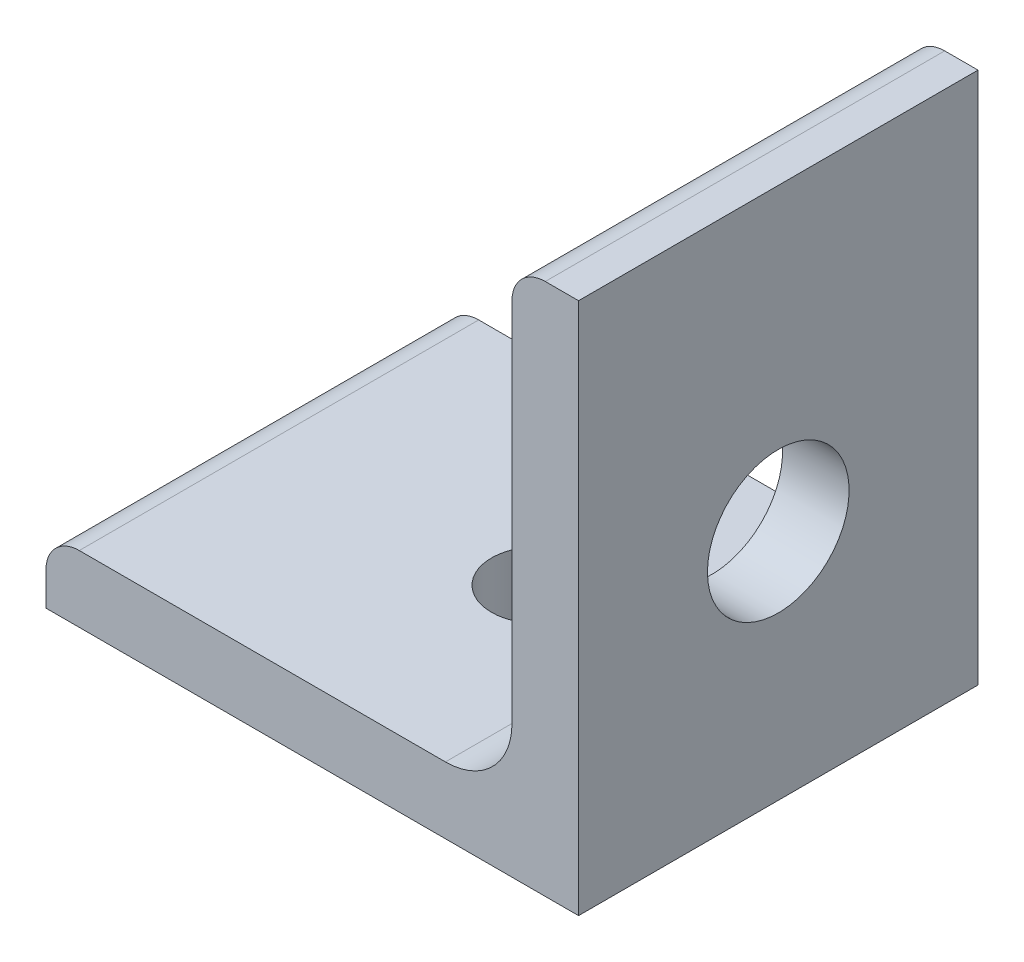
ISO-10303-21;
HEADER;
FILE_DESCRIPTION(('STEP AP214'),'2;1');
FILE_NAME('part.step','',(''),(''),'','','');
FILE_SCHEMA(('AUTOMOTIVE_DESIGN { 1 0 10303 214 1 1 1 1 }'));
ENDSEC;
DATA;
#1=APPLICATION_CONTEXT('core data for automotive mechanical design processes');
#2=APPLICATION_PROTOCOL_DEFINITION('international standard','automotive_design',2000,#1);
#3=PRODUCT_CONTEXT('',#1,'mechanical');
#4=PRODUCT('Part','Part','',(#3));
#5=PRODUCT_RELATED_PRODUCT_CATEGORY('part','',(#4));
#6=PRODUCT_DEFINITION_FORMATION('','',#4);
#7=PRODUCT_DEFINITION_CONTEXT('part definition',#1,'design');
#8=PRODUCT_DEFINITION('design','',#6,#7);
#9=PRODUCT_DEFINITION_SHAPE('','',#8);
#10=(LENGTH_UNIT() NAMED_UNIT(*) SI_UNIT(.MILLI.,.METRE.));
#11=(NAMED_UNIT(*) PLANE_ANGLE_UNIT() SI_UNIT($,.RADIAN.));
#12=(NAMED_UNIT(*) SI_UNIT($,.STERADIAN.) SOLID_ANGLE_UNIT());
#13=UNCERTAINTY_MEASURE_WITH_UNIT(LENGTH_MEASURE(1.E-05),#10,'distance_accuracy_value','');
#14=(GEOMETRIC_REPRESENTATION_CONTEXT(3) GLOBAL_UNCERTAINTY_ASSIGNED_CONTEXT((#13)) GLOBAL_UNIT_ASSIGNED_CONTEXT((#10,
#11,#12)) REPRESENTATION_CONTEXT('',''));
#15=CARTESIAN_POINT('',(0.,0.,0.));
#16=DIRECTION('',(0.,0.,1.));
#17=DIRECTION('',(1.,0.,0.));
#18=AXIS2_PLACEMENT_3D('',#15,#16,#17);
#19=CARTESIAN_POINT('',(-12.7,1.5875,9.525));
#20=DIRECTION('',(1.,0.,0.));
#21=DIRECTION('',(0.,0.,-1.));
#22=AXIS2_PLACEMENT_3D('',#19,#20,#21);
#23=PLANE('',#22);
#24=DIRECTION('',(0.,-1.,0.));
#25=VECTOR('',#24,1.);
#26=CARTESIAN_POINT('',(-12.7,1.5875,-9.525));
#27=LINE('',#26,#25);
#28=CARTESIAN_POINT('',(-12.7,1.5875,-9.525));
#29=VERTEX_POINT('',#28);
#30=CARTESIAN_POINT('',(-12.7,0.,-9.525));
#31=VERTEX_POINT('',#30);
#32=EDGE_CURVE('E147',#29,#31,#27,.T.);
#33=ORIENTED_EDGE('',*,*,#32,.T.);
#34=DIRECTION('',(0.,0.,-1.));
#35=VECTOR('',#34,1.);
#36=CARTESIAN_POINT('',(-12.7,0.,9.525));
#37=LINE('',#36,#35);
#38=CARTESIAN_POINT('',(-12.7,0.,9.525));
#39=VERTEX_POINT('',#38);
#40=EDGE_CURVE('E11',#39,#31,#37,.T.);
#41=ORIENTED_EDGE('',*,*,#40,.F.);
#42=DIRECTION('',(0.,-1.,0.));
#43=VECTOR('',#42,1.);
#44=CARTESIAN_POINT('',(-12.7,1.5875,9.525));
#45=LINE('',#44,#43);
#46=CARTESIAN_POINT('',(-12.7,1.5875,9.525));
#47=VERTEX_POINT('',#46);
#48=EDGE_CURVE('E173',#47,#39,#45,.T.);
#49=ORIENTED_EDGE('',*,*,#48,.F.);
#50=DIRECTION('',(0.,0.,-1.));
#51=VECTOR('',#50,1.);
#52=CARTESIAN_POINT('',(-12.7,1.5875,9.525));
#53=LINE('',#52,#51);
#54=EDGE_CURVE('E143',#47,#29,#53,.T.);
#55=ORIENTED_EDGE('',*,*,#54,.T.);
#56=EDGE_LOOP('',(#33,#41,#49,#55));
#57=FACE_BOUND('',#56,.T.);
#58=ADVANCED_FACE('F40',(#57),#23,.F.);
#59=CARTESIAN_POINT('',(-12.7,0.,9.525));
#60=DIRECTION('',(0.,1.,0.));
#61=DIRECTION('',(0.,0.,1.));
#62=AXIS2_PLACEMENT_3D('',#59,#60,#61);
#63=PLANE('',#62);
#64=CARTESIAN_POINT('',(1.27000000000001,0.,0.));
#65=DIRECTION('',(0.,1.,0.));
#66=DIRECTION('',(0.,0.,1.));
#67=AXIS2_PLACEMENT_3D('',#64,#65,#66);
#68=CIRCLE('',#67,2.2479);
#69=CARTESIAN_POINT('',(1.27000000000001,0.,2.2479));
#70=VERTEX_POINT('',#69);
#71=EDGE_CURVE('E234',#70,#70,#68,.T.);
#72=ORIENTED_EDGE('',*,*,#71,.T.);
#73=EDGE_LOOP('',(#72));
#74=FACE_BOUND('',#73,.T.);
#75=DIRECTION('',(1.,0.,0.));
#76=VECTOR('',#75,1.);
#77=CARTESIAN_POINT('',(-12.7,0.,-9.525));
#78=LINE('',#77,#76);
#79=CARTESIAN_POINT('',(12.7,0.,-9.525));
#80=VERTEX_POINT('',#79);
#81=EDGE_CURVE('E151',#31,#80,#78,.T.);
#82=ORIENTED_EDGE('',*,*,#81,.T.);
#83=DIRECTION('',(0.,0.,-1.));
#84=VECTOR('',#83,1.);
#85=CARTESIAN_POINT('',(12.7,0.,9.525));
#86=LINE('',#85,#84);
#87=CARTESIAN_POINT('',(12.7,0.,9.525));
#88=VERTEX_POINT('',#87);
#89=EDGE_CURVE('E49',#88,#80,#86,.T.);
#90=ORIENTED_EDGE('',*,*,#89,.F.);
#91=DIRECTION('',(1.,0.,0.));
#92=VECTOR('',#91,1.);
#93=CARTESIAN_POINT('',(-12.7,0.,9.525));
#94=LINE('',#93,#92);
#95=EDGE_CURVE('E103',#39,#88,#94,.T.);
#96=ORIENTED_EDGE('',*,*,#95,.F.);
#97=ORIENTED_EDGE('',*,*,#40,.T.);
#98=EDGE_LOOP('',(#82,#90,#96,#97));
#99=FACE_BOUND('',#98,.T.);
#100=ADVANCED_FACE('F258',(#74,#99),#63,.F.);
#101=CARTESIAN_POINT('',(12.7,0.,9.525));
#102=DIRECTION('',(-1.,0.,0.));
#103=DIRECTION('',(0.,0.,1.));
#104=AXIS2_PLACEMENT_3D('',#101,#102,#103);
#105=PLANE('',#104);
#106=CARTESIAN_POINT('',(12.7,11.1166148,0.));
#107=DIRECTION('',(-1.,0.,0.));
#108=DIRECTION('',(0.,0.,1.));
#109=AXIS2_PLACEMENT_3D('',#106,#107,#108);
#110=CIRCLE('',#109,3.3782);
#111=CARTESIAN_POINT('',(12.7,11.1166148,3.3782));
#112=VERTEX_POINT('',#111);
#113=EDGE_CURVE('E152',#112,#112,#110,.T.);
#114=ORIENTED_EDGE('',*,*,#113,.T.);
#115=EDGE_LOOP('',(#114));
#116=FACE_BOUND('',#115,.T.);
#117=DIRECTION('',(0.,1.,0.));
#118=VECTOR('',#117,1.);
#119=CARTESIAN_POINT('',(12.7,0.,-9.525));
#120=LINE('',#119,#118);
#121=CARTESIAN_POINT('',(12.7,25.4,-9.525));
#122=VERTEX_POINT('',#121);
#123=EDGE_CURVE('E155',#80,#122,#120,.T.);
#124=ORIENTED_EDGE('',*,*,#123,.T.);
#125=DIRECTION('',(0.,0.,-1.));
#126=VECTOR('',#125,1.);
#127=CARTESIAN_POINT('',(12.7,25.4,9.525));
#128=LINE('',#127,#126);
#129=CARTESIAN_POINT('',(12.7,25.4,9.525));
#130=VERTEX_POINT('',#129);
#131=EDGE_CURVE('E188',#130,#122,#128,.T.);
#132=ORIENTED_EDGE('',*,*,#131,.F.);
#133=DIRECTION('',(0.,1.,0.));
#134=VECTOR('',#133,1.);
#135=CARTESIAN_POINT('',(12.7,0.,9.525));
#136=LINE('',#135,#134);
#137=EDGE_CURVE('E198',#88,#130,#136,.T.);
#138=ORIENTED_EDGE('',*,*,#137,.F.);
#139=ORIENTED_EDGE('',*,*,#89,.T.);
#140=EDGE_LOOP('',(#124,#132,#138,#139));
#141=FACE_BOUND('',#140,.T.);
#142=ADVANCED_FACE('F196',(#116,#141),#105,.F.);
#143=CARTESIAN_POINT('',(11.1125,25.4,9.525));
#144=DIRECTION('',(0.,-1.,0.));
#145=DIRECTION('',(0.,0.,-1.));
#146=AXIS2_PLACEMENT_3D('',#143,#144,#145);
#147=PLANE('',#146);
#148=DIRECTION('',(-1.,0.,0.));
#149=VECTOR('',#148,1.);
#150=CARTESIAN_POINT('',(11.1125,25.4,-9.525));
#151=LINE('',#150,#149);
#152=CARTESIAN_POINT('',(11.1125,25.4,-9.525));
#153=VERTEX_POINT('',#152);
#154=EDGE_CURVE('E158',#122,#153,#151,.T.);
#155=ORIENTED_EDGE('',*,*,#154,.T.);
#156=DIRECTION('',(0.,0.,-1.));
#157=VECTOR('',#156,1.);
#158=CARTESIAN_POINT('',(11.1125,25.4,9.525));
#159=LINE('',#158,#157);
#160=CARTESIAN_POINT('',(11.1125,25.4,9.525));
#161=VERTEX_POINT('',#160);
#162=EDGE_CURVE('E184',#161,#153,#159,.T.);
#163=ORIENTED_EDGE('',*,*,#162,.F.);
#164=DIRECTION('',(-1.,0.,0.));
#165=VECTOR('',#164,1.);
#166=CARTESIAN_POINT('',(11.1125,25.4,9.525));
#167=LINE('',#166,#165);
#168=EDGE_CURVE('E215',#130,#161,#167,.T.);
#169=ORIENTED_EDGE('',*,*,#168,.F.);
#170=ORIENTED_EDGE('',*,*,#131,.T.);
#171=EDGE_LOOP('',(#155,#163,#169,#170));
#172=FACE_BOUND('',#171,.T.);
#173=ADVANCED_FACE('F207',(#172),#147,.F.);
#174=CARTESIAN_POINT('',(11.1125,23.8125,9.525));
#175=DIRECTION('',(0.,0.,-1.));
#176=DIRECTION('',(-1.,0.,0.));
#177=AXIS2_PLACEMENT_3D('',#174,#175,#176);
#178=CYLINDRICAL_SURFACE('',#177,1.5875);
#179=CARTESIAN_POINT('',(11.1125,23.8125,-9.525));
#180=DIRECTION('',(0.,0.,1.));
#181=DIRECTION('',(-1.,0.,0.));
#182=AXIS2_PLACEMENT_3D('',#179,#180,#181);
#183=CIRCLE('',#182,1.5875);
#184=CARTESIAN_POINT('',(9.525,23.8125,-9.525));
#185=VERTEX_POINT('',#184);
#186=EDGE_CURVE('E161',#153,#185,#183,.T.);
#187=ORIENTED_EDGE('',*,*,#186,.T.);
#188=DIRECTION('',(0.,0.,-1.));
#189=VECTOR('',#188,1.);
#190=CARTESIAN_POINT('',(9.525,23.8125,9.525));
#191=LINE('',#190,#189);
#192=CARTESIAN_POINT('',(9.525,23.8125,9.525));
#193=VERTEX_POINT('',#192);
#194=EDGE_CURVE('E180',#193,#185,#191,.T.);
#195=ORIENTED_EDGE('',*,*,#194,.F.);
#196=CARTESIAN_POINT('',(11.1125,23.8125,9.525));
#197=DIRECTION('',(0.,0.,1.));
#198=DIRECTION('',(-1.,0.,0.));
#199=AXIS2_PLACEMENT_3D('',#196,#197,#198);
#200=CIRCLE('',#199,1.5875);
#201=EDGE_CURVE('E213',#161,#193,#200,.T.);
#202=ORIENTED_EDGE('',*,*,#201,.F.);
#203=ORIENTED_EDGE('',*,*,#162,.T.);
#204=EDGE_LOOP('',(#187,#195,#202,#203));
#205=FACE_BOUND('',#204,.T.);
#206=ADVANCED_FACE('F211',(#205),#178,.T.);
#207=CARTESIAN_POINT('',(9.525,23.8125,9.525));
#208=DIRECTION('',(1.,0.,0.));
#209=DIRECTION('',(0.,0.,-1.));
#210=AXIS2_PLACEMENT_3D('',#207,#208,#209);
#211=PLANE('',#210);
#212=CARTESIAN_POINT('',(9.525,11.1166148,0.));
#213=DIRECTION('',(-1.,0.,0.));
#214=DIRECTION('',(0.,0.,1.));
#215=AXIS2_PLACEMENT_3D('',#212,#213,#214);
#216=CIRCLE('',#215,3.3782);
#217=CARTESIAN_POINT('',(9.525,11.1166148,3.3782));
#218=VERTEX_POINT('',#217);
#219=EDGE_CURVE('E230',#218,#218,#216,.T.);
#220=ORIENTED_EDGE('',*,*,#219,.F.);
#221=EDGE_LOOP('',(#220));
#222=FACE_BOUND('',#221,.T.);
#223=DIRECTION('',(0.,-1.,0.));
#224=VECTOR('',#223,1.);
#225=CARTESIAN_POINT('',(9.525,23.8125,-9.525));
#226=LINE('',#225,#224);
#227=CARTESIAN_POINT('',(9.525,6.35,-9.525));
#228=VERTEX_POINT('',#227);
#229=EDGE_CURVE('E164',#185,#228,#226,.T.);
#230=ORIENTED_EDGE('',*,*,#229,.T.);
#231=DIRECTION('',(0.,0.,-1.));
#232=VECTOR('',#231,1.);
#233=CARTESIAN_POINT('',(9.525,6.35,9.525));
#234=LINE('',#233,#232);
#235=CARTESIAN_POINT('',(9.525,6.35,9.525));
#236=VERTEX_POINT('',#235);
#237=EDGE_CURVE('E136',#236,#228,#234,.T.);
#238=ORIENTED_EDGE('',*,*,#237,.F.);
#239=DIRECTION('',(0.,-1.,0.));
#240=VECTOR('',#239,1.);
#241=CARTESIAN_POINT('',(9.525,23.8125,9.525));
#242=LINE('',#241,#240);
#243=EDGE_CURVE('E125',#193,#236,#242,.T.);
#244=ORIENTED_EDGE('',*,*,#243,.F.);
#245=ORIENTED_EDGE('',*,*,#194,.T.);
#246=EDGE_LOOP('',(#230,#238,#244,#245));
#247=FACE_BOUND('',#246,.T.);
#248=ADVANCED_FACE('F255',(#222,#247),#211,.F.);
#249=CARTESIAN_POINT('',(6.35000000000001,6.35,9.525));
#250=DIRECTION('',(0.,0.,-1.));
#251=DIRECTION('',(-1.,0.,0.));
#252=AXIS2_PLACEMENT_3D('',#249,#250,#251);
#253=CYLINDRICAL_SURFACE('',#252,3.175);
#254=CARTESIAN_POINT('',(6.35000000000001,6.35,-9.525));
#255=DIRECTION('',(0.,0.,-1.));
#256=DIRECTION('',(-1.,0.,0.));
#257=AXIS2_PLACEMENT_3D('',#254,#255,#256);
#258=CIRCLE('',#257,3.175);
#259=CARTESIAN_POINT('',(6.35000000000001,3.175,-9.525));
#260=VERTEX_POINT('',#259);
#261=EDGE_CURVE('E134',#228,#260,#258,.T.);
#262=ORIENTED_EDGE('',*,*,#261,.T.);
#263=DIRECTION('',(0.,0.,-1.));
#264=VECTOR('',#263,1.);
#265=CARTESIAN_POINT('',(6.35000000000001,3.175,9.525));
#266=LINE('',#265,#264);
#267=CARTESIAN_POINT('',(6.35000000000001,3.175,9.525));
#268=VERTEX_POINT('',#267);
#269=EDGE_CURVE('E131',#268,#260,#266,.T.);
#270=ORIENTED_EDGE('',*,*,#269,.F.);
#271=CARTESIAN_POINT('',(6.35000000000001,6.35,9.525));
#272=DIRECTION('',(0.,0.,-1.));
#273=DIRECTION('',(-1.,0.,0.));
#274=AXIS2_PLACEMENT_3D('',#271,#272,#273);
#275=CIRCLE('',#274,3.175);
#276=EDGE_CURVE('E119',#236,#268,#275,.T.);
#277=ORIENTED_EDGE('',*,*,#276,.F.);
#278=ORIENTED_EDGE('',*,*,#237,.T.);
#279=EDGE_LOOP('',(#262,#270,#277,#278));
#280=FACE_BOUND('',#279,.T.);
#281=ADVANCED_FACE('F132',(#280),#253,.F.);
#282=CARTESIAN_POINT('',(6.35000000000001,3.175,9.525));
#283=DIRECTION('',(0.,-1.,0.));
#284=DIRECTION('',(1.,0.,0.));
#285=AXIS2_PLACEMENT_3D('',#282,#283,#284);
#286=PLANE('',#285);
#287=CARTESIAN_POINT('',(1.27000000000001,3.175,0.));
#288=DIRECTION('',(0.,1.,0.));
#289=DIRECTION('',(0.,0.,1.));
#290=AXIS2_PLACEMENT_3D('',#287,#288,#289);
#291=CIRCLE('',#290,2.2479);
#292=CARTESIAN_POINT('',(1.27000000000001,3.175,2.2479));
#293=VERTEX_POINT('',#292);
#294=EDGE_CURVE('E238',#293,#293,#291,.T.);
#295=ORIENTED_EDGE('',*,*,#294,.F.);
#296=EDGE_LOOP('',(#295));
#297=FACE_BOUND('',#296,.T.);
#298=DIRECTION('',(-1.,0.,0.));
#299=VECTOR('',#298,1.);
#300=CARTESIAN_POINT('',(6.35000000000001,3.175,-9.525));
#301=LINE('',#300,#299);
#302=CARTESIAN_POINT('',(-11.1125,3.175,-9.525));
#303=VERTEX_POINT('',#302);
#304=EDGE_CURVE('E89',#260,#303,#301,.T.);
#305=ORIENTED_EDGE('',*,*,#304,.T.);
#306=DIRECTION('',(0.,0.,-1.));
#307=VECTOR('',#306,1.);
#308=CARTESIAN_POINT('',(-11.1125,3.175,9.525));
#309=LINE('',#308,#307);
#310=CARTESIAN_POINT('',(-11.1125,3.175,9.525));
#311=VERTEX_POINT('',#310);
#312=EDGE_CURVE('E137',#311,#303,#309,.T.);
#313=ORIENTED_EDGE('',*,*,#312,.F.);
#314=DIRECTION('',(-1.,0.,0.));
#315=VECTOR('',#314,1.);
#316=CARTESIAN_POINT('',(6.35000000000001,3.175,9.525));
#317=LINE('',#316,#315);
#318=EDGE_CURVE('E123',#268,#311,#317,.T.);
#319=ORIENTED_EDGE('',*,*,#318,.F.);
#320=ORIENTED_EDGE('',*,*,#269,.T.);
#321=EDGE_LOOP('',(#305,#313,#319,#320));
#322=FACE_BOUND('',#321,.T.);
#323=ADVANCED_FACE('F139',(#297,#322),#286,.F.);
#324=CARTESIAN_POINT('',(-11.1125,1.5875,9.525));
#325=DIRECTION('',(0.,0.,-1.));
#326=DIRECTION('',(-1.,0.,0.));
#327=AXIS2_PLACEMENT_3D('',#324,#325,#326);
#328=CYLINDRICAL_SURFACE('',#327,1.5875);
#329=CARTESIAN_POINT('',(-11.1125,1.5875,-9.525));
#330=DIRECTION('',(0.,0.,1.));
#331=DIRECTION('',(-1.,0.,0.));
#332=AXIS2_PLACEMENT_3D('',#329,#330,#331);
#333=CIRCLE('',#332,1.5875);
#334=EDGE_CURVE('E95',#303,#29,#333,.T.);
#335=ORIENTED_EDGE('',*,*,#334,.T.);
#336=ORIENTED_EDGE('',*,*,#54,.F.);
#337=CARTESIAN_POINT('',(-11.1125,1.5875,9.525));
#338=DIRECTION('',(0.,0.,1.));
#339=DIRECTION('',(-1.,0.,0.));
#340=AXIS2_PLACEMENT_3D('',#337,#338,#339);
#341=CIRCLE('',#340,1.5875);
#342=EDGE_CURVE('E57',#311,#47,#341,.T.);
#343=ORIENTED_EDGE('',*,*,#342,.F.);
#344=ORIENTED_EDGE('',*,*,#312,.T.);
#345=EDGE_LOOP('',(#335,#336,#343,#344));
#346=FACE_BOUND('',#345,.T.);
#347=ADVANCED_FACE('F246',(#346),#328,.T.);
#348=CARTESIAN_POINT('',(11.1125,23.8125,9.525));
#349=DIRECTION('',(0.,0.,-1.));
#350=DIRECTION('',(-1.,0.,0.));
#351=AXIS2_PLACEMENT_3D('',#348,#349,#350);
#352=PLANE('',#351);
#353=ORIENTED_EDGE('',*,*,#48,.T.);
#354=ORIENTED_EDGE('',*,*,#95,.T.);
#355=ORIENTED_EDGE('',*,*,#137,.T.);
#356=ORIENTED_EDGE('',*,*,#168,.T.);
#357=ORIENTED_EDGE('',*,*,#201,.T.);
#358=ORIENTED_EDGE('',*,*,#243,.T.);
#359=ORIENTED_EDGE('',*,*,#276,.T.);
#360=ORIENTED_EDGE('',*,*,#318,.T.);
#361=ORIENTED_EDGE('',*,*,#342,.T.);
#362=EDGE_LOOP('',(#353,#354,#355,#356,#357,#358,#359,#360,#361));
#363=FACE_BOUND('',#362,.T.);
#364=ADVANCED_FACE('F121',(#363),#352,.F.);
#365=CARTESIAN_POINT('',(11.1125,23.8125,-9.525));
#366=DIRECTION('',(0.,0.,-1.));
#367=DIRECTION('',(-1.,0.,0.));
#368=AXIS2_PLACEMENT_3D('',#365,#366,#367);
#369=PLANE('',#368);
#370=ORIENTED_EDGE('',*,*,#32,.F.);
#371=ORIENTED_EDGE('',*,*,#334,.F.);
#372=ORIENTED_EDGE('',*,*,#304,.F.);
#373=ORIENTED_EDGE('',*,*,#261,.F.);
#374=ORIENTED_EDGE('',*,*,#229,.F.);
#375=ORIENTED_EDGE('',*,*,#186,.F.);
#376=ORIENTED_EDGE('',*,*,#154,.F.);
#377=ORIENTED_EDGE('',*,*,#123,.F.);
#378=ORIENTED_EDGE('',*,*,#81,.F.);
#379=EDGE_LOOP('',(#370,#371,#372,#373,#374,#375,#376,#377,#378));
#380=FACE_BOUND('',#379,.T.);
#381=ADVANCED_FACE('F202',(#380),#369,.T.);
#382=CARTESIAN_POINT('',(9.525,11.1166148,0.));
#383=DIRECTION('',(-1.,0.,0.));
#384=DIRECTION('',(0.,0.,1.));
#385=AXIS2_PLACEMENT_3D('',#382,#383,#384);
#386=CYLINDRICAL_SURFACE('',#385,3.3782);
#387=ORIENTED_EDGE('',*,*,#113,.F.);
#388=EDGE_LOOP('',(#387));
#389=FACE_BOUND('',#388,.T.);
#390=ORIENTED_EDGE('',*,*,#219,.T.);
#391=EDGE_LOOP('',(#390));
#392=FACE_BOUND('',#391,.T.);
#393=ADVANCED_FACE('F286',(#389,#392),#386,.F.);
#394=CARTESIAN_POINT('',(1.27000000000001,3.175,0.));
#395=DIRECTION('',(0.,1.,0.));
#396=DIRECTION('',(0.,0.,1.));
#397=AXIS2_PLACEMENT_3D('',#394,#395,#396);
#398=CYLINDRICAL_SURFACE('',#397,2.2479);
#399=ORIENTED_EDGE('',*,*,#71,.F.);
#400=EDGE_LOOP('',(#399));
#401=FACE_BOUND('',#400,.T.);
#402=ORIENTED_EDGE('',*,*,#294,.T.);
#403=EDGE_LOOP('',(#402));
#404=FACE_BOUND('',#403,.T.);
#405=ADVANCED_FACE('F243',(#401,#404),#398,.F.);
#406=CLOSED_SHELL('',(#58,#100,#142,#173,#206,#248,#281,#323,#347,#364,#381,#393,#405));
#407=MANIFOLD_SOLID_BREP('B2',#406);
#408=ADVANCED_BREP_SHAPE_REPRESENTATION('',(#18,#407),#14);
#409=SHAPE_DEFINITION_REPRESENTATION(#9,#408);
ENDSEC;
END-ISO-10303-21;
